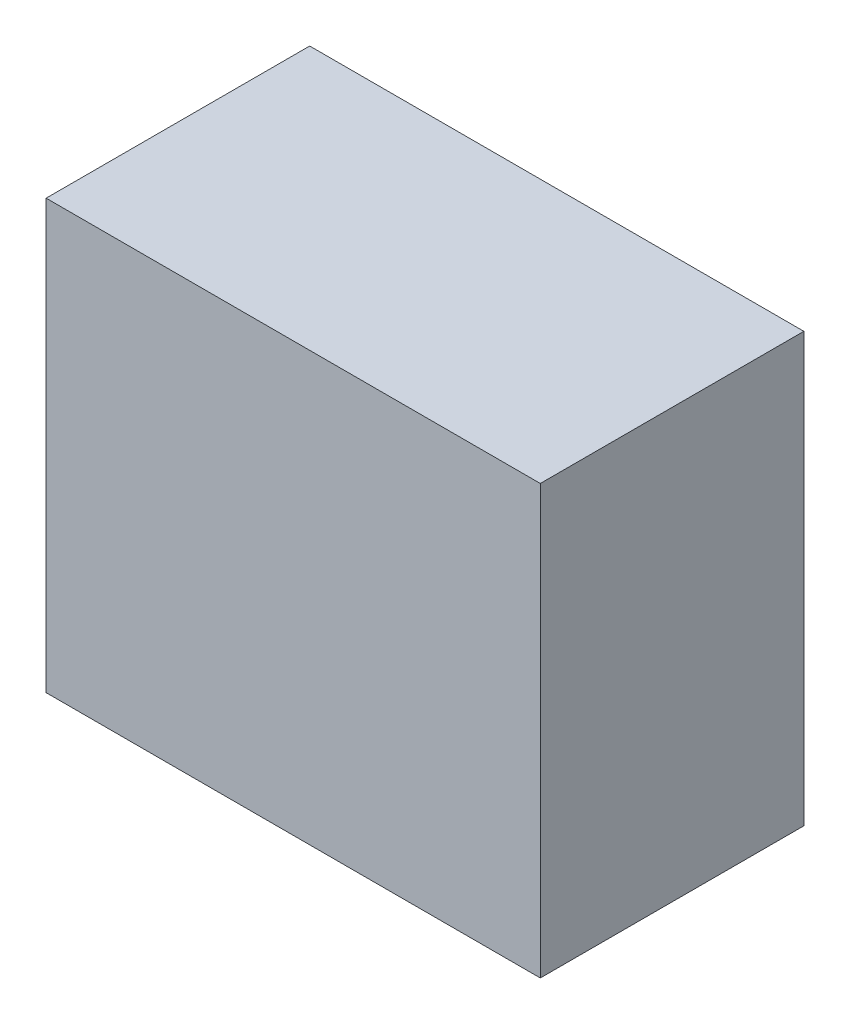
ISO-10303-21;
HEADER;
FILE_DESCRIPTION(('STEP AP214'),'2;1');
FILE_NAME('part.step','',(''),(''),'','','');
FILE_SCHEMA(('AUTOMOTIVE_DESIGN { 1 0 10303 214 1 1 1 1 }'));
ENDSEC;
DATA;
#1=APPLICATION_CONTEXT('core data for automotive mechanical design processes');
#2=APPLICATION_PROTOCOL_DEFINITION('international standard','automotive_design',2000,#1);
#3=PRODUCT_CONTEXT('',#1,'mechanical');
#4=PRODUCT('Part','Part','',(#3));
#5=PRODUCT_RELATED_PRODUCT_CATEGORY('part','',(#4));
#6=PRODUCT_DEFINITION_FORMATION('','',#4);
#7=PRODUCT_DEFINITION_CONTEXT('part definition',#1,'design');
#8=PRODUCT_DEFINITION('design','',#6,#7);
#9=PRODUCT_DEFINITION_SHAPE('','',#8);
#10=(LENGTH_UNIT() NAMED_UNIT(*) SI_UNIT(.MILLI.,.METRE.));
#11=(NAMED_UNIT(*) PLANE_ANGLE_UNIT() SI_UNIT($,.RADIAN.));
#12=(NAMED_UNIT(*) SI_UNIT($,.STERADIAN.) SOLID_ANGLE_UNIT());
#13=UNCERTAINTY_MEASURE_WITH_UNIT(LENGTH_MEASURE(1.E-05),#10,'distance_accuracy_value','');
#14=(GEOMETRIC_REPRESENTATION_CONTEXT(3) GLOBAL_UNCERTAINTY_ASSIGNED_CONTEXT((#13)) GLOBAL_UNIT_ASSIGNED_CONTEXT((#10,
#11,#12)) REPRESENTATION_CONTEXT('',''));
#15=CARTESIAN_POINT('',(0.,0.,0.));
#16=DIRECTION('',(0.,0.,1.));
#17=DIRECTION('',(1.,0.,0.));
#18=AXIS2_PLACEMENT_3D('',#15,#16,#17);
#19=CARTESIAN_POINT('',(-482.171326192233,-309.730519005755,203.2));
#20=DIRECTION('',(-1.,0.,0.));
#21=DIRECTION('',(0.,-1.,0.));
#22=AXIS2_PLACEMENT_3D('',#19,#20,#21);
#23=PLANE('',#22);
#24=DIRECTION('',(0.,1.,0.));
#25=VECTOR('',#24,1.);
#26=CARTESIAN_POINT('',(-482.171326192233,-309.730519005755,0.));
#27=LINE('',#26,#25);
#28=CARTESIAN_POINT('',(-482.171326192233,-309.730519005755,0.));
#29=VERTEX_POINT('',#28);
#30=CARTESIAN_POINT('',(-482.171326192233,20.4694809942447,0.));
#31=VERTEX_POINT('',#30);
#32=EDGE_CURVE('E107',#29,#31,#27,.T.);
#33=ORIENTED_EDGE('',*,*,#32,.T.);
#34=DIRECTION('',(0.,0.,-1.));
#35=VECTOR('',#34,1.);
#36=CARTESIAN_POINT('',(-482.171326192233,20.4694809942447,203.2));
#37=LINE('',#36,#35);
#38=CARTESIAN_POINT('',(-482.171326192233,20.4694809942447,203.2));
#39=VERTEX_POINT('',#38);
#40=EDGE_CURVE('E11',#39,#31,#37,.T.);
#41=ORIENTED_EDGE('',*,*,#40,.F.);
#42=DIRECTION('',(0.,1.,0.));
#43=VECTOR('',#42,1.);
#44=CARTESIAN_POINT('',(-482.171326192233,-309.730519005755,203.2));
#45=LINE('',#44,#43);
#46=CARTESIAN_POINT('',(-482.171326192233,-309.730519005755,203.2));
#47=VERTEX_POINT('',#46);
#48=EDGE_CURVE('E90',#47,#39,#45,.T.);
#49=ORIENTED_EDGE('',*,*,#48,.F.);
#50=DIRECTION('',(0.,0.,-1.));
#51=VECTOR('',#50,1.);
#52=CARTESIAN_POINT('',(-482.171326192233,-309.730519005755,203.2));
#53=LINE('',#52,#51);
#54=EDGE_CURVE('E103',#47,#29,#53,.T.);
#55=ORIENTED_EDGE('',*,*,#54,.T.);
#56=EDGE_LOOP('',(#33,#41,#49,#55));
#57=FACE_BOUND('',#56,.T.);
#58=ADVANCED_FACE('F38',(#57),#23,.F.);
#59=CARTESIAN_POINT('',(-482.171326192233,20.4694809942447,203.2));
#60=DIRECTION('',(0.,-1.,0.));
#61=DIRECTION('',(0.,0.,-1.));
#62=AXIS2_PLACEMENT_3D('',#59,#60,#61);
#63=PLANE('',#62);
#64=DIRECTION('',(-1.,0.,0.));
#65=VECTOR('',#64,1.);
#66=CARTESIAN_POINT('',(-482.171326192233,20.4694809942447,0.));
#67=LINE('',#66,#65);
#68=CARTESIAN_POINT('',(-863.171326192233,20.4694809942447,0.));
#69=VERTEX_POINT('',#68);
#70=EDGE_CURVE('E95',#31,#69,#67,.T.);
#71=ORIENTED_EDGE('',*,*,#70,.T.);
#72=DIRECTION('',(0.,0.,-1.));
#73=VECTOR('',#72,1.);
#74=CARTESIAN_POINT('',(-863.171326192233,20.4694809942447,203.2));
#75=LINE('',#74,#73);
#76=CARTESIAN_POINT('',(-863.171326192233,20.4694809942447,203.2));
#77=VERTEX_POINT('',#76);
#78=EDGE_CURVE('E47',#77,#69,#75,.T.);
#79=ORIENTED_EDGE('',*,*,#78,.F.);
#80=DIRECTION('',(-1.,0.,0.));
#81=VECTOR('',#80,1.);
#82=CARTESIAN_POINT('',(-482.171326192233,20.4694809942447,203.2));
#83=LINE('',#82,#81);
#84=EDGE_CURVE('E85',#39,#77,#83,.T.);
#85=ORIENTED_EDGE('',*,*,#84,.F.);
#86=ORIENTED_EDGE('',*,*,#40,.T.);
#87=EDGE_LOOP('',(#71,#79,#85,#86));
#88=FACE_BOUND('',#87,.T.);
#89=ADVANCED_FACE('F94',(#88),#63,.F.);
#90=CARTESIAN_POINT('',(-863.171326192233,-309.730519005755,203.2));
#91=DIRECTION('',(1.,0.,0.));
#92=DIRECTION('',(0.,0.,-1.));
#93=AXIS2_PLACEMENT_3D('',#90,#91,#92);
#94=PLANE('',#93);
#95=DIRECTION('',(0.,-1.,0.));
#96=VECTOR('',#95,1.);
#97=CARTESIAN_POINT('',(-863.171326192233,-309.730519005755,0.));
#98=LINE('',#97,#96);
#99=CARTESIAN_POINT('',(-863.171326192233,-309.730519005755,0.));
#100=VERTEX_POINT('',#99);
#101=EDGE_CURVE('E72',#69,#100,#98,.T.);
#102=ORIENTED_EDGE('',*,*,#101,.T.);
#103=DIRECTION('',(0.,0.,-1.));
#104=VECTOR('',#103,1.);
#105=CARTESIAN_POINT('',(-863.171326192233,-309.730519005755,203.2));
#106=LINE('',#105,#104);
#107=CARTESIAN_POINT('',(-863.171326192233,-309.730519005755,203.2));
#108=VERTEX_POINT('',#107);
#109=EDGE_CURVE('E97',#108,#100,#106,.T.);
#110=ORIENTED_EDGE('',*,*,#109,.F.);
#111=DIRECTION('',(0.,-1.,0.));
#112=VECTOR('',#111,1.);
#113=CARTESIAN_POINT('',(-863.171326192233,-309.730519005755,203.2));
#114=LINE('',#113,#112);
#115=EDGE_CURVE('E88',#77,#108,#114,.T.);
#116=ORIENTED_EDGE('',*,*,#115,.F.);
#117=ORIENTED_EDGE('',*,*,#78,.T.);
#118=EDGE_LOOP('',(#102,#110,#116,#117));
#119=FACE_BOUND('',#118,.T.);
#120=ADVANCED_FACE('F98',(#119),#94,.F.);
#121=CARTESIAN_POINT('',(-482.171326192233,-309.730519005755,203.2));
#122=DIRECTION('',(0.,1.,0.));
#123=DIRECTION('',(-1.,0.,0.));
#124=AXIS2_PLACEMENT_3D('',#121,#122,#123);
#125=PLANE('',#124);
#126=DIRECTION('',(1.,0.,0.));
#127=VECTOR('',#126,1.);
#128=CARTESIAN_POINT('',(-482.171326192233,-309.730519005755,0.));
#129=LINE('',#128,#127);
#130=EDGE_CURVE('E78',#100,#29,#129,.T.);
#131=ORIENTED_EDGE('',*,*,#130,.T.);
#132=ORIENTED_EDGE('',*,*,#54,.F.);
#133=DIRECTION('',(1.,0.,0.));
#134=VECTOR('',#133,1.);
#135=CARTESIAN_POINT('',(-482.171326192233,-309.730519005755,203.2));
#136=LINE('',#135,#134);
#137=EDGE_CURVE('E55',#108,#47,#136,.T.);
#138=ORIENTED_EDGE('',*,*,#137,.F.);
#139=ORIENTED_EDGE('',*,*,#109,.T.);
#140=EDGE_LOOP('',(#131,#132,#138,#139));
#141=FACE_BOUND('',#140,.T.);
#142=ADVANCED_FACE('F121',(#141),#125,.F.);
#143=CARTESIAN_POINT('',(0.,0.,203.2));
#144=DIRECTION('',(0.,0.,1.));
#145=DIRECTION('',(1.,0.,0.));
#146=AXIS2_PLACEMENT_3D('',#143,#144,#145);
#147=PLANE('',#146);
#148=ORIENTED_EDGE('',*,*,#48,.T.);
#149=ORIENTED_EDGE('',*,*,#84,.T.);
#150=ORIENTED_EDGE('',*,*,#115,.T.);
#151=ORIENTED_EDGE('',*,*,#137,.T.);
#152=EDGE_LOOP('',(#148,#149,#150,#151));
#153=FACE_BOUND('',#152,.T.);
#154=ADVANCED_FACE('F86',(#153),#147,.T.);
#155=CARTESIAN_POINT('',(0.,0.,0.));
#156=DIRECTION('',(0.,0.,1.));
#157=DIRECTION('',(1.,0.,0.));
#158=AXIS2_PLACEMENT_3D('',#155,#156,#157);
#159=PLANE('',#158);
#160=ORIENTED_EDGE('',*,*,#32,.F.);
#161=ORIENTED_EDGE('',*,*,#130,.F.);
#162=ORIENTED_EDGE('',*,*,#101,.F.);
#163=ORIENTED_EDGE('',*,*,#70,.F.);
#164=EDGE_LOOP('',(#160,#161,#162,#163));
#165=FACE_BOUND('',#164,.T.);
#166=ADVANCED_FACE('F124',(#165),#159,.F.);
#167=CLOSED_SHELL('',(#58,#89,#120,#142,#154,#166));
#168=MANIFOLD_SOLID_BREP('B2',#167);
#169=ADVANCED_BREP_SHAPE_REPRESENTATION('',(#18,#168),#14);
#170=SHAPE_DEFINITION_REPRESENTATION(#9,#169);
ENDSEC;
END-ISO-10303-21;
